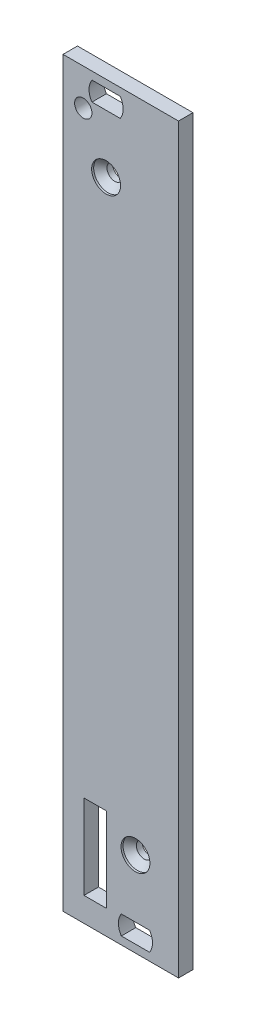
ISO-10303-21;
HEADER;
FILE_DESCRIPTION(('STEP AP214'),'2;1');
FILE_NAME('part.step','',(''),(''),'','','');
FILE_SCHEMA(('AUTOMOTIVE_DESIGN { 1 0 10303 214 1 1 1 1 }'));
ENDSEC;
DATA;
#1=APPLICATION_CONTEXT('core data for automotive mechanical design processes');
#2=APPLICATION_PROTOCOL_DEFINITION('international standard','automotive_design',2000,#1);
#3=PRODUCT_CONTEXT('',#1,'mechanical');
#4=PRODUCT('Part','Part','',(#3));
#5=PRODUCT_RELATED_PRODUCT_CATEGORY('part','',(#4));
#6=PRODUCT_DEFINITION_FORMATION('','',#4);
#7=PRODUCT_DEFINITION_CONTEXT('part definition',#1,'design');
#8=PRODUCT_DEFINITION('design','',#6,#7);
#9=PRODUCT_DEFINITION_SHAPE('','',#8);
#10=(LENGTH_UNIT() NAMED_UNIT(*) SI_UNIT(.MILLI.,.METRE.));
#11=(NAMED_UNIT(*) PLANE_ANGLE_UNIT() SI_UNIT($,.RADIAN.));
#12=(NAMED_UNIT(*) SI_UNIT($,.STERADIAN.) SOLID_ANGLE_UNIT());
#13=UNCERTAINTY_MEASURE_WITH_UNIT(LENGTH_MEASURE(1.E-05),#10,'distance_accuracy_value','');
#14=(GEOMETRIC_REPRESENTATION_CONTEXT(3) GLOBAL_UNCERTAINTY_ASSIGNED_CONTEXT((#13)) GLOBAL_UNIT_ASSIGNED_CONTEXT((#10,
#11,#12)) REPRESENTATION_CONTEXT('',''));
#15=CARTESIAN_POINT('',(0.,0.,0.));
#16=DIRECTION('',(0.,0.,1.));
#17=DIRECTION('',(1.,0.,0.));
#18=AXIS2_PLACEMENT_3D('',#15,#16,#17);
#19=CARTESIAN_POINT('',(5.07999999999998,11.7,2.5));
#20=DIRECTION('',(0.,0.,-1.));
#21=DIRECTION('',(-1.,0.,0.));
#22=AXIS2_PLACEMENT_3D('',#19,#20,#21);
#23=CYLINDRICAL_SURFACE('',#22,2.5);
#24=CARTESIAN_POINT('',(5.07999999999998,11.7,2.5));
#25=DIRECTION('',(0.,0.,-1.));
#26=DIRECTION('',(-1.,0.,0.));
#27=AXIS2_PLACEMENT_3D('',#24,#25,#26);
#28=CIRCLE('',#27,2.5);
#29=CARTESIAN_POINT('',(2.57999999999998,11.7,2.5));
#30=VERTEX_POINT('',#29);
#31=EDGE_CURVE('E21',#30,#30,#28,.F.);
#32=ORIENTED_EDGE('',*,*,#31,.T.);
#33=EDGE_LOOP('',(#32));
#34=FACE_BOUND('',#33,.T.);
#35=CARTESIAN_POINT('',(5.07999999999998,11.7,2.1499999999719));
#36=DIRECTION('',(0.,0.,1.));
#37=DIRECTION('',(1.,0.,0.));
#38=AXIS2_PLACEMENT_3D('',#35,#36,#37);
#39=CIRCLE('',#38,2.50000000007544);
#40=CARTESIAN_POINT('',(7.58000000007542,11.7,2.1499999999719));
#41=VERTEX_POINT('',#40);
#42=EDGE_CURVE('E179',#41,#41,#39,.F.);
#43=ORIENTED_EDGE('',*,*,#42,.T.);
#44=EDGE_LOOP('',(#43));
#45=FACE_BOUND('',#44,.T.);
#46=ADVANCED_FACE('F18',(#34,#45),#23,.F.);
#47=CARTESIAN_POINT('',(0.,110.7,2.5));
#48=DIRECTION('',(0.,0.,-1.));
#49=DIRECTION('',(-1.,0.,0.));
#50=AXIS2_PLACEMENT_3D('',#47,#48,#49);
#51=CYLINDRICAL_SURFACE('',#50,2.5);
#52=CARTESIAN_POINT('',(0.,110.7,2.15000000002874));
#53=DIRECTION('',(0.,0.,1.));
#54=DIRECTION('',(1.,0.,0.));
#55=AXIS2_PLACEMENT_3D('',#52,#53,#54);
#56=CIRCLE('',#55,2.50000000005459);
#57=CARTESIAN_POINT('',(2.50000000005457,110.7,2.15000000002874));
#58=VERTEX_POINT('',#57);
#59=EDGE_CURVE('E139',#58,#58,#56,.F.);
#60=ORIENTED_EDGE('',*,*,#59,.T.);
#61=EDGE_LOOP('',(#60));
#62=FACE_BOUND('',#61,.T.);
#63=CARTESIAN_POINT('',(0.,110.7,2.5));
#64=DIRECTION('',(0.,0.,-1.));
#65=DIRECTION('',(-1.,0.,0.));
#66=AXIS2_PLACEMENT_3D('',#63,#64,#65);
#67=CIRCLE('',#66,2.5);
#68=CARTESIAN_POINT('',(-2.50000000000002,110.7,2.5));
#69=VERTEX_POINT('',#68);
#70=EDGE_CURVE('E178',#69,#69,#67,.F.);
#71=ORIENTED_EDGE('',*,*,#70,.T.);
#72=EDGE_LOOP('',(#71));
#73=FACE_BOUND('',#72,.T.);
#74=ADVANCED_FACE('F417',(#62,#73),#51,.F.);
#75=CARTESIAN_POINT('',(5.07999999999998,11.7,2.15000000002874));
#76=DIRECTION('',(0.,0.,1.));
#77=DIRECTION('',(1.,0.,0.));
#78=AXIS2_PLACEMENT_3D('',#75,#76,#77);
#79=CONICAL_SURFACE('',#78,2.50000000013228,0.785398163397448);
#80=CARTESIAN_POINT('',(5.07999999999998,11.7,1.));
#81=DIRECTION('',(0.,0.,-1.));
#82=DIRECTION('',(-1.,0.,0.));
#83=AXIS2_PLACEMENT_3D('',#80,#81,#82);
#84=CIRCLE('',#83,1.35);
#85=CARTESIAN_POINT('',(3.72999999999998,11.7,1.));
#86=VERTEX_POINT('',#85);
#87=EDGE_CURVE('E172',#86,#86,#84,.T.);
#88=ORIENTED_EDGE('',*,*,#87,.T.);
#89=EDGE_LOOP('',(#88));
#90=FACE_BOUND('',#89,.T.);
#91=ORIENTED_EDGE('',*,*,#42,.F.);
#92=EDGE_LOOP('',(#91));
#93=FACE_BOUND('',#92,.T.);
#94=ADVANCED_FACE('F228',(#90,#93),#79,.F.);
#95=CARTESIAN_POINT('',(12.53,125.4,2.5));
#96=DIRECTION('',(0.,0.,-1.));
#97=DIRECTION('',(-1.,0.,0.));
#98=AXIS2_PLACEMENT_3D('',#95,#96,#97);
#99=PLANE('',#98);
#100=ORIENTED_EDGE('',*,*,#70,.F.);
#101=EDGE_LOOP('',(#100));
#102=FACE_BOUND('',#101,.T.);
#103=CARTESIAN_POINT('',(0.,122.4,2.5));
#104=DIRECTION('',(0.,0.,-1.));
#105=DIRECTION('',(-1.,0.,0.));
#106=AXIS2_PLACEMENT_3D('',#103,#104,#105);
#107=CIRCLE('',#106,2.95);
#108=CARTESIAN_POINT('',(2.44540385212748,124.05,2.5));
#109=VERTEX_POINT('',#108);
#110=CARTESIAN_POINT('',(2.44540385212748,120.75,2.5));
#111=VERTEX_POINT('',#110);
#112=EDGE_CURVE('E166',#109,#111,#107,.T.);
#113=ORIENTED_EDGE('',*,*,#112,.T.);
#114=DIRECTION('',(1.,0.,0.));
#115=VECTOR('',#114,1.);
#116=CARTESIAN_POINT('',(2.44540385212748,120.75,2.5));
#117=LINE('',#116,#115);
#118=CARTESIAN_POINT('',(-2.44540385212752,120.75,2.5));
#119=VERTEX_POINT('',#118);
#120=EDGE_CURVE('E154',#111,#119,#117,.F.);
#121=ORIENTED_EDGE('',*,*,#120,.T.);
#122=CARTESIAN_POINT('',(0.,122.4,2.5));
#123=DIRECTION('',(0.,0.,-1.));
#124=DIRECTION('',(-1.,0.,0.));
#125=AXIS2_PLACEMENT_3D('',#122,#123,#124);
#126=CIRCLE('',#125,2.95);
#127=CARTESIAN_POINT('',(-2.44540385212752,124.05,2.5));
#128=VERTEX_POINT('',#127);
#129=EDGE_CURVE('E206',#119,#128,#126,.T.);
#130=ORIENTED_EDGE('',*,*,#129,.T.);
#131=DIRECTION('',(1.,0.,0.));
#132=VECTOR('',#131,1.);
#133=CARTESIAN_POINT('',(-2.44540385212752,124.05,2.5));
#134=LINE('',#133,#132);
#135=EDGE_CURVE('E158',#128,#109,#134,.T.);
#136=ORIENTED_EDGE('',*,*,#135,.T.);
#137=EDGE_LOOP('',(#113,#121,#130,#136));
#138=FACE_BOUND('',#137,.T.);
#139=CARTESIAN_POINT('',(5.07999999999998,0.,2.5));
#140=DIRECTION('',(0.,0.,-1.));
#141=DIRECTION('',(-1.,0.,0.));
#142=AXIS2_PLACEMENT_3D('',#139,#140,#141);
#143=CIRCLE('',#142,2.95);
#144=CARTESIAN_POINT('',(7.52540385212747,1.64999999999997,2.5));
#145=VERTEX_POINT('',#144);
#146=CARTESIAN_POINT('',(7.52540385212748,-1.65000000000003,2.5));
#147=VERTEX_POINT('',#146);
#148=EDGE_CURVE('E84',#145,#147,#143,.T.);
#149=ORIENTED_EDGE('',*,*,#148,.T.);
#150=DIRECTION('',(1.,0.,0.));
#151=VECTOR('',#150,1.);
#152=CARTESIAN_POINT('',(7.52540385212748,-1.65000000000003,2.5));
#153=LINE('',#152,#151);
#154=CARTESIAN_POINT('',(2.63459614787248,-1.65000000000003,2.5));
#155=VERTEX_POINT('',#154);
#156=EDGE_CURVE('E163',#147,#155,#153,.F.);
#157=ORIENTED_EDGE('',*,*,#156,.T.);
#158=CARTESIAN_POINT('',(5.07999999999998,0.,2.5));
#159=DIRECTION('',(0.,0.,-1.));
#160=DIRECTION('',(-1.,0.,0.));
#161=AXIS2_PLACEMENT_3D('',#158,#159,#160);
#162=CIRCLE('',#161,2.95);
#163=CARTESIAN_POINT('',(2.63459614787248,1.64999999999997,2.5));
#164=VERTEX_POINT('',#163);
#165=EDGE_CURVE('E210',#155,#164,#162,.T.);
#166=ORIENTED_EDGE('',*,*,#165,.T.);
#167=DIRECTION('',(1.,0.,0.));
#168=VECTOR('',#167,1.);
#169=CARTESIAN_POINT('',(2.63459614787248,1.64999999999997,2.5));
#170=LINE('',#169,#168);
#171=EDGE_CURVE('E168',#164,#145,#170,.T.);
#172=ORIENTED_EDGE('',*,*,#171,.T.);
#173=EDGE_LOOP('',(#149,#157,#166,#172));
#174=FACE_BOUND('',#173,.T.);
#175=ORIENTED_EDGE('',*,*,#31,.F.);
#176=EDGE_LOOP('',(#175));
#177=FACE_BOUND('',#176,.T.);
#178=DIRECTION('',(0.,1.,0.));
#179=VECTOR('',#178,1.);
#180=CARTESIAN_POINT('',(0.079999999999977,1.19999999999995,2.5));
#181=LINE('',#180,#179);
#182=CARTESIAN_POINT('',(0.0799999999999774,15.8,2.5));
#183=VERTEX_POINT('',#182);
#184=CARTESIAN_POINT('',(0.0799999999999771,1.19999999999995,2.5));
#185=VERTEX_POINT('',#184);
#186=EDGE_CURVE('E93',#183,#185,#181,.F.);
#187=ORIENTED_EDGE('',*,*,#186,.T.);
#188=DIRECTION('',(1.,0.,0.));
#189=VECTOR('',#188,1.);
#190=CARTESIAN_POINT('',(0.079999999999977,1.19999999999995,2.5));
#191=LINE('',#190,#189);
#192=CARTESIAN_POINT('',(-3.82000000000002,1.19999999999995,2.5));
#193=VERTEX_POINT('',#192);
#194=EDGE_CURVE('E175',#185,#193,#191,.F.);
#195=ORIENTED_EDGE('',*,*,#194,.T.);
#196=DIRECTION('',(0.,1.,0.));
#197=VECTOR('',#196,1.);
#198=CARTESIAN_POINT('',(-3.82000000000002,1.19999999999995,2.5));
#199=LINE('',#198,#197);
#200=CARTESIAN_POINT('',(-3.82000000000002,15.8,2.5));
#201=VERTEX_POINT('',#200);
#202=EDGE_CURVE('E324',#193,#201,#199,.T.);
#203=ORIENTED_EDGE('',*,*,#202,.T.);
#204=DIRECTION('',(1.,0.,0.));
#205=VECTOR('',#204,1.);
#206=CARTESIAN_POINT('',(0.079999999999977,15.8,2.5));
#207=LINE('',#206,#205);
#208=EDGE_CURVE('E321',#201,#183,#207,.T.);
#209=ORIENTED_EDGE('',*,*,#208,.T.);
#210=EDGE_LOOP('',(#187,#195,#203,#209));
#211=FACE_BOUND('',#210,.T.);
#212=CARTESIAN_POINT('',(-3.95000000000002,119.1,2.5));
#213=DIRECTION('',(0.,0.,-1.));
#214=DIRECTION('',(-1.,0.,0.));
#215=AXIS2_PLACEMENT_3D('',#212,#213,#214);
#216=CIRCLE('',#215,1.5);
#217=CARTESIAN_POINT('',(-5.45000000000002,119.1,2.5));
#218=VERTEX_POINT('',#217);
#219=EDGE_CURVE('E215',#218,#218,#216,.T.);
#220=ORIENTED_EDGE('',*,*,#219,.T.);
#221=EDGE_LOOP('',(#220));
#222=FACE_BOUND('',#221,.T.);
#223=DIRECTION('',(1.,0.,0.));
#224=VECTOR('',#223,1.);
#225=CARTESIAN_POINT('',(-7.45000000000002,125.4,2.5));
#226=LINE('',#225,#224);
#227=CARTESIAN_POINT('',(12.53,125.4,2.5));
#228=VERTEX_POINT('',#227);
#229=CARTESIAN_POINT('',(-7.45000000000002,125.4,2.5));
#230=VERTEX_POINT('',#229);
#231=EDGE_CURVE('E369',#228,#230,#226,.F.);
#232=ORIENTED_EDGE('',*,*,#231,.T.);
#233=DIRECTION('',(0.,1.,0.));
#234=VECTOR('',#233,1.);
#235=CARTESIAN_POINT('',(-7.45000000000002,-3.00000000000004,2.5));
#236=LINE('',#235,#234);
#237=CARTESIAN_POINT('',(-7.45000000000002,-3.00000000000003,2.5));
#238=VERTEX_POINT('',#237);
#239=EDGE_CURVE('E124',#230,#238,#236,.F.);
#240=ORIENTED_EDGE('',*,*,#239,.T.);
#241=DIRECTION('',(1.,0.,0.));
#242=VECTOR('',#241,1.);
#243=CARTESIAN_POINT('',(-7.45000000000002,-3.00000000000004,2.5));
#244=LINE('',#243,#242);
#245=CARTESIAN_POINT('',(12.53,-3.00000000000003,2.5));
#246=VERTEX_POINT('',#245);
#247=EDGE_CURVE('E118',#238,#246,#244,.T.);
#248=ORIENTED_EDGE('',*,*,#247,.T.);
#249=DIRECTION('',(0.,1.,0.));
#250=VECTOR('',#249,1.);
#251=CARTESIAN_POINT('',(12.53,-3.00000000000004,2.5));
#252=LINE('',#251,#250);
#253=EDGE_CURVE('E121',#246,#228,#252,.T.);
#254=ORIENTED_EDGE('',*,*,#253,.T.);
#255=EDGE_LOOP('',(#232,#240,#248,#254));
#256=FACE_BOUND('',#255,.T.);
#257=ADVANCED_FACE('F120',(#102,#138,#174,#177,#211,#222,#256),#99,.F.);
#258=CARTESIAN_POINT('',(0.,110.7,2.14999999991505));
#259=DIRECTION('',(0.,0.,1.));
#260=DIRECTION('',(1.,0.,0.));
#261=AXIS2_PLACEMENT_3D('',#258,#259,#260);
#262=CONICAL_SURFACE('',#261,2.4999999999409,0.785398163422163);
#263=CARTESIAN_POINT('',(0.,110.7,1.));
#264=DIRECTION('',(0.,0.,-1.));
#265=DIRECTION('',(-1.,0.,0.));
#266=AXIS2_PLACEMENT_3D('',#263,#264,#265);
#267=CIRCLE('',#266,1.35);
#268=CARTESIAN_POINT('',(-1.35000000000001,110.7,1.));
#269=VERTEX_POINT('',#268);
#270=EDGE_CURVE('E150',#269,#269,#267,.T.);
#271=ORIENTED_EDGE('',*,*,#270,.T.);
#272=EDGE_LOOP('',(#271));
#273=FACE_BOUND('',#272,.T.);
#274=ORIENTED_EDGE('',*,*,#59,.F.);
#275=EDGE_LOOP('',(#274));
#276=FACE_BOUND('',#275,.T.);
#277=ADVANCED_FACE('F227',(#273,#276),#262,.F.);
#278=CARTESIAN_POINT('',(12.53,-3.00000000000004,2.5));
#279=DIRECTION('',(-1.,0.,0.));
#280=DIRECTION('',(0.,0.,1.));
#281=AXIS2_PLACEMENT_3D('',#278,#279,#280);
#282=PLANE('',#281);
#283=DIRECTION('',(0.,0.,-1.));
#284=VECTOR('',#283,1.);
#285=CARTESIAN_POINT('',(12.53,125.4,2.5));
#286=LINE('',#285,#284);
#287=CARTESIAN_POINT('',(12.53,125.4,0.));
#288=VERTEX_POINT('',#287);
#289=EDGE_CURVE('E137',#288,#228,#286,.F.);
#290=ORIENTED_EDGE('',*,*,#289,.T.);
#291=ORIENTED_EDGE('',*,*,#253,.F.);
#292=DIRECTION('',(0.,0.,1.));
#293=VECTOR('',#292,1.);
#294=CARTESIAN_POINT('',(12.53,-3.00000000000004,2.5));
#295=LINE('',#294,#293);
#296=CARTESIAN_POINT('',(12.53,-3.00000000000003,0.));
#297=VERTEX_POINT('',#296);
#298=EDGE_CURVE('E129',#246,#297,#295,.F.);
#299=ORIENTED_EDGE('',*,*,#298,.T.);
#300=DIRECTION('',(0.,1.,0.));
#301=VECTOR('',#300,1.);
#302=CARTESIAN_POINT('',(12.53,125.4,0.));
#303=LINE('',#302,#301);
#304=EDGE_CURVE('E153',#288,#297,#303,.F.);
#305=ORIENTED_EDGE('',*,*,#304,.F.);
#306=EDGE_LOOP('',(#290,#291,#299,#305));
#307=FACE_BOUND('',#306,.T.);
#308=ADVANCED_FACE('F133',(#307),#282,.F.);
#309=CARTESIAN_POINT('',(-7.45000000000002,-3.00000000000004,2.5));
#310=DIRECTION('',(0.,1.,0.));
#311=DIRECTION('',(0.,0.,1.));
#312=AXIS2_PLACEMENT_3D('',#309,#310,#311);
#313=PLANE('',#312);
#314=ORIENTED_EDGE('',*,*,#298,.F.);
#315=ORIENTED_EDGE('',*,*,#247,.F.);
#316=DIRECTION('',(0.,0.,-1.));
#317=VECTOR('',#316,1.);
#318=CARTESIAN_POINT('',(-7.45000000000002,-3.00000000000004,2.5));
#319=LINE('',#318,#317);
#320=CARTESIAN_POINT('',(-7.45000000000002,-3.00000000000003,0.));
#321=VERTEX_POINT('',#320);
#322=EDGE_CURVE('E146',#238,#321,#319,.T.);
#323=ORIENTED_EDGE('',*,*,#322,.T.);
#324=DIRECTION('',(-1.,0.,0.));
#325=VECTOR('',#324,1.);
#326=CARTESIAN_POINT('',(12.53,-3.00000000000003,0.));
#327=LINE('',#326,#325);
#328=EDGE_CURVE('E143',#297,#321,#327,.T.);
#329=ORIENTED_EDGE('',*,*,#328,.F.);
#330=EDGE_LOOP('',(#314,#315,#323,#329));
#331=FACE_BOUND('',#330,.T.);
#332=ADVANCED_FACE('F141',(#331),#313,.F.);
#333=CARTESIAN_POINT('',(-7.45000000000002,-3.00000000000004,2.5));
#334=DIRECTION('',(1.,0.,0.));
#335=DIRECTION('',(0.,0.,-1.));
#336=AXIS2_PLACEMENT_3D('',#333,#334,#335);
#337=PLANE('',#336);
#338=ORIENTED_EDGE('',*,*,#322,.F.);
#339=ORIENTED_EDGE('',*,*,#239,.F.);
#340=DIRECTION('',(0.,0.,-1.));
#341=VECTOR('',#340,1.);
#342=CARTESIAN_POINT('',(-7.45000000000002,125.4,2.5));
#343=LINE('',#342,#341);
#344=CARTESIAN_POINT('',(-7.45000000000002,125.4,0.));
#345=VERTEX_POINT('',#344);
#346=EDGE_CURVE('E217',#230,#345,#343,.T.);
#347=ORIENTED_EDGE('',*,*,#346,.T.);
#348=DIRECTION('',(0.,1.,0.));
#349=VECTOR('',#348,1.);
#350=CARTESIAN_POINT('',(-7.45000000000002,125.4,0.));
#351=LINE('',#350,#349);
#352=EDGE_CURVE('E343',#321,#345,#351,.T.);
#353=ORIENTED_EDGE('',*,*,#352,.F.);
#354=EDGE_LOOP('',(#338,#339,#347,#353));
#355=FACE_BOUND('',#354,.T.);
#356=ADVANCED_FACE('F248',(#355),#337,.F.);
#357=CARTESIAN_POINT('',(-7.45000000000002,125.4,2.5));
#358=DIRECTION('',(0.,-1.,0.));
#359=DIRECTION('',(0.,0.,-1.));
#360=AXIS2_PLACEMENT_3D('',#357,#358,#359);
#361=PLANE('',#360);
#362=ORIENTED_EDGE('',*,*,#346,.F.);
#363=ORIENTED_EDGE('',*,*,#231,.F.);
#364=ORIENTED_EDGE('',*,*,#289,.F.);
#365=DIRECTION('',(-1.,0.,0.));
#366=VECTOR('',#365,1.);
#367=CARTESIAN_POINT('',(12.53,125.4,0.));
#368=LINE('',#367,#366);
#369=EDGE_CURVE('E205',#345,#288,#368,.F.);
#370=ORIENTED_EDGE('',*,*,#369,.F.);
#371=EDGE_LOOP('',(#362,#363,#364,#370));
#372=FACE_BOUND('',#371,.T.);
#373=ADVANCED_FACE('F237',(#372),#361,.F.);
#374=CARTESIAN_POINT('',(-3.95000000000002,119.1,0.));
#375=DIRECTION('',(0.,0.,-1.));
#376=DIRECTION('',(-1.,0.,0.));
#377=AXIS2_PLACEMENT_3D('',#374,#375,#376);
#378=CYLINDRICAL_SURFACE('',#377,1.5);
#379=CARTESIAN_POINT('',(-3.95000000000002,119.1,0.));
#380=DIRECTION('',(0.,0.,-1.));
#381=DIRECTION('',(-1.,0.,0.));
#382=AXIS2_PLACEMENT_3D('',#379,#380,#381);
#383=CIRCLE('',#382,1.5);
#384=CARTESIAN_POINT('',(-5.45000000000002,119.1,0.));
#385=VERTEX_POINT('',#384);
#386=EDGE_CURVE('E201',#385,#385,#383,.F.);
#387=ORIENTED_EDGE('',*,*,#386,.F.);
#388=EDGE_LOOP('',(#387));
#389=FACE_BOUND('',#388,.T.);
#390=ORIENTED_EDGE('',*,*,#219,.F.);
#391=EDGE_LOOP('',(#390));
#392=FACE_BOUND('',#391,.T.);
#393=ADVANCED_FACE('F234',(#389,#392),#378,.F.);
#394=CARTESIAN_POINT('',(0.079999999999977,1.19999999999995,0.));
#395=DIRECTION('',(1.,0.,0.));
#396=DIRECTION('',(0.,0.,-1.));
#397=AXIS2_PLACEMENT_3D('',#394,#395,#396);
#398=PLANE('',#397);
#399=DIRECTION('',(0.,0.,1.));
#400=VECTOR('',#399,1.);
#401=CARTESIAN_POINT('',(0.0799999999999779,15.8,0.));
#402=LINE('',#401,#400);
#403=CARTESIAN_POINT('',(0.0799999999999774,15.8,0.));
#404=VERTEX_POINT('',#403);
#405=EDGE_CURVE('E363',#183,#404,#402,.F.);
#406=ORIENTED_EDGE('',*,*,#405,.T.);
#407=DIRECTION('',(0.,1.,0.));
#408=VECTOR('',#407,1.);
#409=CARTESIAN_POINT('',(0.0799999999999777,125.4,0.));
#410=LINE('',#409,#408);
#411=CARTESIAN_POINT('',(0.0799999999999771,1.19999999999995,0.));
#412=VERTEX_POINT('',#411);
#413=EDGE_CURVE('E204',#412,#404,#410,.T.);
#414=ORIENTED_EDGE('',*,*,#413,.F.);
#415=DIRECTION('',(0.,0.,-1.));
#416=VECTOR('',#415,1.);
#417=CARTESIAN_POINT('',(0.079999999999977,1.19999999999995,0.));
#418=LINE('',#417,#416);
#419=EDGE_CURVE('E358',#412,#185,#418,.F.);
#420=ORIENTED_EDGE('',*,*,#419,.T.);
#421=ORIENTED_EDGE('',*,*,#186,.F.);
#422=EDGE_LOOP('',(#406,#414,#420,#421));
#423=FACE_BOUND('',#422,.T.);
#424=ADVANCED_FACE('F236',(#423),#398,.F.);
#425=CARTESIAN_POINT('',(0.079999999999977,15.8,0.));
#426=DIRECTION('',(0.,1.,0.));
#427=DIRECTION('',(0.,0.,1.));
#428=AXIS2_PLACEMENT_3D('',#425,#426,#427);
#429=PLANE('',#428);
#430=DIRECTION('',(0.,0.,1.));
#431=VECTOR('',#430,1.);
#432=CARTESIAN_POINT('',(-3.82000000000002,15.8,0.));
#433=LINE('',#432,#431);
#434=CARTESIAN_POINT('',(-3.82000000000002,15.8,0.));
#435=VERTEX_POINT('',#434);
#436=EDGE_CURVE('E314',#201,#435,#433,.F.);
#437=ORIENTED_EDGE('',*,*,#436,.T.);
#438=DIRECTION('',(-1.,0.,0.));
#439=VECTOR('',#438,1.);
#440=CARTESIAN_POINT('',(12.53,15.8,0.));
#441=LINE('',#440,#439);
#442=EDGE_CURVE('E319',#404,#435,#441,.T.);
#443=ORIENTED_EDGE('',*,*,#442,.F.);
#444=ORIENTED_EDGE('',*,*,#405,.F.);
#445=ORIENTED_EDGE('',*,*,#208,.F.);
#446=EDGE_LOOP('',(#437,#443,#444,#445));
#447=FACE_BOUND('',#446,.T.);
#448=ADVANCED_FACE('F245',(#447),#429,.F.);
#449=CARTESIAN_POINT('',(-3.82000000000002,1.19999999999995,0.));
#450=DIRECTION('',(-1.,0.,0.));
#451=DIRECTION('',(0.,0.,1.));
#452=AXIS2_PLACEMENT_3D('',#449,#450,#451);
#453=PLANE('',#452);
#454=DIRECTION('',(0.,0.,-1.));
#455=VECTOR('',#454,1.);
#456=CARTESIAN_POINT('',(-3.82000000000002,1.19999999999995,0.));
#457=LINE('',#456,#455);
#458=CARTESIAN_POINT('',(-3.82000000000002,1.19999999999995,0.));
#459=VERTEX_POINT('',#458);
#460=EDGE_CURVE('E330',#193,#459,#457,.T.);
#461=ORIENTED_EDGE('',*,*,#460,.T.);
#462=DIRECTION('',(0.,1.,0.));
#463=VECTOR('',#462,1.);
#464=CARTESIAN_POINT('',(-3.82000000000002,125.4,0.));
#465=LINE('',#464,#463);
#466=EDGE_CURVE('E328',#435,#459,#465,.F.);
#467=ORIENTED_EDGE('',*,*,#466,.F.);
#468=ORIENTED_EDGE('',*,*,#436,.F.);
#469=ORIENTED_EDGE('',*,*,#202,.F.);
#470=EDGE_LOOP('',(#461,#467,#468,#469));
#471=FACE_BOUND('',#470,.T.);
#472=ADVANCED_FACE('F301',(#471),#453,.F.);
#473=CARTESIAN_POINT('',(0.079999999999977,1.19999999999995,0.));
#474=DIRECTION('',(0.,-1.,0.));
#475=DIRECTION('',(0.,0.,-1.));
#476=AXIS2_PLACEMENT_3D('',#473,#474,#475);
#477=PLANE('',#476);
#478=ORIENTED_EDGE('',*,*,#419,.F.);
#479=DIRECTION('',(-1.,0.,0.));
#480=VECTOR('',#479,1.);
#481=CARTESIAN_POINT('',(12.53,1.19999999999995,0.));
#482=LINE('',#481,#480);
#483=EDGE_CURVE('E200',#459,#412,#482,.F.);
#484=ORIENTED_EDGE('',*,*,#483,.F.);
#485=ORIENTED_EDGE('',*,*,#460,.F.);
#486=ORIENTED_EDGE('',*,*,#194,.F.);
#487=EDGE_LOOP('',(#478,#484,#485,#486));
#488=FACE_BOUND('',#487,.T.);
#489=ADVANCED_FACE('F297',(#488),#477,.F.);
#490=CARTESIAN_POINT('',(5.07999999999998,11.7,2.5));
#491=DIRECTION('',(0.,0.,-1.));
#492=DIRECTION('',(-1.,0.,0.));
#493=AXIS2_PLACEMENT_3D('',#490,#491,#492);
#494=CYLINDRICAL_SURFACE('',#493,1.35);
#495=CARTESIAN_POINT('',(5.07999999999998,11.7,0.));
#496=DIRECTION('',(0.,0.,-1.));
#497=DIRECTION('',(-1.,0.,0.));
#498=AXIS2_PLACEMENT_3D('',#495,#496,#497);
#499=CIRCLE('',#498,1.35);
#500=CARTESIAN_POINT('',(3.72999999999998,11.7,0.));
#501=VERTEX_POINT('',#500);
#502=EDGE_CURVE('E197',#501,#501,#499,.F.);
#503=ORIENTED_EDGE('',*,*,#502,.F.);
#504=EDGE_LOOP('',(#503));
#505=FACE_BOUND('',#504,.T.);
#506=ORIENTED_EDGE('',*,*,#87,.F.);
#507=EDGE_LOOP('',(#506));
#508=FACE_BOUND('',#507,.T.);
#509=ADVANCED_FACE('F294',(#505,#508),#494,.F.);
#510=CARTESIAN_POINT('',(5.07999999999998,0.,0.));
#511=DIRECTION('',(0.,0.,-1.));
#512=DIRECTION('',(-1.,0.,0.));
#513=AXIS2_PLACEMENT_3D('',#510,#511,#512);
#514=CYLINDRICAL_SURFACE('',#513,2.95);
#515=DIRECTION('',(0.,0.,-1.));
#516=VECTOR('',#515,1.);
#517=CARTESIAN_POINT('',(7.52540385212748,-1.65000000000003,0.));
#518=LINE('',#517,#516);
#519=CARTESIAN_POINT('',(7.52540385212747,-1.65000000000004,0.));
#520=VERTEX_POINT('',#519);
#521=EDGE_CURVE('E167',#520,#147,#518,.F.);
#522=ORIENTED_EDGE('',*,*,#521,.T.);
#523=ORIENTED_EDGE('',*,*,#148,.F.);
#524=DIRECTION('',(0.,0.,1.));
#525=VECTOR('',#524,1.);
#526=CARTESIAN_POINT('',(7.52540385212748,1.64999999999997,0.));
#527=LINE('',#526,#525);
#528=CARTESIAN_POINT('',(7.52540385212747,1.64999999999997,0.));
#529=VERTEX_POINT('',#528);
#530=EDGE_CURVE('E171',#145,#529,#527,.F.);
#531=ORIENTED_EDGE('',*,*,#530,.T.);
#532=CARTESIAN_POINT('',(5.07999999999998,0.,0.));
#533=DIRECTION('',(0.,0.,-1.));
#534=DIRECTION('',(-1.,0.,0.));
#535=AXIS2_PLACEMENT_3D('',#532,#533,#534);
#536=CIRCLE('',#535,2.95);
#537=EDGE_CURVE('E194',#520,#529,#536,.F.);
#538=ORIENTED_EDGE('',*,*,#537,.F.);
#539=EDGE_LOOP('',(#522,#523,#531,#538));
#540=FACE_BOUND('',#539,.T.);
#541=ADVANCED_FACE('F290',(#540),#514,.F.);
#542=CARTESIAN_POINT('',(2.63459614787248,1.64999999999997,0.));
#543=DIRECTION('',(0.,1.,0.));
#544=DIRECTION('',(0.,0.,1.));
#545=AXIS2_PLACEMENT_3D('',#542,#543,#544);
#546=PLANE('',#545);
#547=DIRECTION('',(0.,0.,-1.));
#548=VECTOR('',#547,1.);
#549=CARTESIAN_POINT('',(2.63459614787248,1.64999999999997,0.));
#550=LINE('',#549,#548);
#551=CARTESIAN_POINT('',(2.63459614787248,1.64999999999997,0.));
#552=VERTEX_POINT('',#551);
#553=EDGE_CURVE('E170',#164,#552,#550,.T.);
#554=ORIENTED_EDGE('',*,*,#553,.T.);
#555=DIRECTION('',(-1.,0.,0.));
#556=VECTOR('',#555,1.);
#557=CARTESIAN_POINT('',(12.53,1.64999999999997,0.));
#558=LINE('',#557,#556);
#559=EDGE_CURVE('E193',#529,#552,#558,.T.);
#560=ORIENTED_EDGE('',*,*,#559,.F.);
#561=ORIENTED_EDGE('',*,*,#530,.F.);
#562=ORIENTED_EDGE('',*,*,#171,.F.);
#563=EDGE_LOOP('',(#554,#560,#561,#562));
#564=FACE_BOUND('',#563,.T.);
#565=ADVANCED_FACE('F286',(#564),#546,.F.);
#566=CARTESIAN_POINT('',(5.07999999999998,0.,0.));
#567=DIRECTION('',(0.,0.,-1.));
#568=DIRECTION('',(-1.,0.,0.));
#569=AXIS2_PLACEMENT_3D('',#566,#567,#568);
#570=CYLINDRICAL_SURFACE('',#569,2.95);
#571=DIRECTION('',(0.,0.,-1.));
#572=VECTOR('',#571,1.);
#573=CARTESIAN_POINT('',(2.63459614787248,-1.65000000000003,0.));
#574=LINE('',#573,#572);
#575=CARTESIAN_POINT('',(2.63459614787248,-1.65000000000004,0.));
#576=VERTEX_POINT('',#575);
#577=EDGE_CURVE('E213',#155,#576,#574,.T.);
#578=ORIENTED_EDGE('',*,*,#577,.T.);
#579=CARTESIAN_POINT('',(5.07999999999998,0.,0.));
#580=DIRECTION('',(0.,0.,-1.));
#581=DIRECTION('',(-1.,0.,0.));
#582=AXIS2_PLACEMENT_3D('',#579,#580,#581);
#583=CIRCLE('',#582,2.95);
#584=EDGE_CURVE('E190',#552,#576,#583,.F.);
#585=ORIENTED_EDGE('',*,*,#584,.F.);
#586=ORIENTED_EDGE('',*,*,#553,.F.);
#587=ORIENTED_EDGE('',*,*,#165,.F.);
#588=EDGE_LOOP('',(#578,#585,#586,#587));
#589=FACE_BOUND('',#588,.T.);
#590=ADVANCED_FACE('F282',(#589),#570,.F.);
#591=CARTESIAN_POINT('',(7.52540385212748,-1.65000000000003,0.));
#592=DIRECTION('',(0.,-1.,0.));
#593=DIRECTION('',(0.,0.,-1.));
#594=AXIS2_PLACEMENT_3D('',#591,#592,#593);
#595=PLANE('',#594);
#596=ORIENTED_EDGE('',*,*,#521,.F.);
#597=DIRECTION('',(-1.,0.,0.));
#598=VECTOR('',#597,1.);
#599=CARTESIAN_POINT('',(12.53,-1.65000000000004,0.));
#600=LINE('',#599,#598);
#601=EDGE_CURVE('E189',#576,#520,#600,.F.);
#602=ORIENTED_EDGE('',*,*,#601,.F.);
#603=ORIENTED_EDGE('',*,*,#577,.F.);
#604=ORIENTED_EDGE('',*,*,#156,.F.);
#605=EDGE_LOOP('',(#596,#602,#603,#604));
#606=FACE_BOUND('',#605,.T.);
#607=ADVANCED_FACE('F278',(#606),#595,.F.);
#608=CARTESIAN_POINT('',(0.,122.4,0.));
#609=DIRECTION('',(0.,0.,-1.));
#610=DIRECTION('',(-1.,0.,0.));
#611=AXIS2_PLACEMENT_3D('',#608,#609,#610);
#612=CYLINDRICAL_SURFACE('',#611,2.95);
#613=DIRECTION('',(0.,0.,-1.));
#614=VECTOR('',#613,1.);
#615=CARTESIAN_POINT('',(2.44540385212748,120.75,0.));
#616=LINE('',#615,#614);
#617=CARTESIAN_POINT('',(2.44540385212748,120.75,0.));
#618=VERTEX_POINT('',#617);
#619=EDGE_CURVE('E157',#618,#111,#616,.F.);
#620=ORIENTED_EDGE('',*,*,#619,.T.);
#621=ORIENTED_EDGE('',*,*,#112,.F.);
#622=DIRECTION('',(0.,0.,1.));
#623=VECTOR('',#622,1.);
#624=CARTESIAN_POINT('',(2.44540385212748,124.05,0.));
#625=LINE('',#624,#623);
#626=CARTESIAN_POINT('',(2.44540385212748,124.05,0.));
#627=VERTEX_POINT('',#626);
#628=EDGE_CURVE('E162',#109,#627,#625,.F.);
#629=ORIENTED_EDGE('',*,*,#628,.T.);
#630=CARTESIAN_POINT('',(0.,122.4,0.));
#631=DIRECTION('',(0.,0.,-1.));
#632=DIRECTION('',(-1.,0.,0.));
#633=AXIS2_PLACEMENT_3D('',#630,#631,#632);
#634=CIRCLE('',#633,2.95);
#635=EDGE_CURVE('E186',#618,#627,#634,.F.);
#636=ORIENTED_EDGE('',*,*,#635,.F.);
#637=EDGE_LOOP('',(#620,#621,#629,#636));
#638=FACE_BOUND('',#637,.T.);
#639=ADVANCED_FACE('F274',(#638),#612,.F.);
#640=CARTESIAN_POINT('',(-2.44540385212752,124.05,0.));
#641=DIRECTION('',(0.,1.,0.));
#642=DIRECTION('',(0.,0.,1.));
#643=AXIS2_PLACEMENT_3D('',#640,#641,#642);
#644=PLANE('',#643);
#645=DIRECTION('',(0.,0.,-1.));
#646=VECTOR('',#645,1.);
#647=CARTESIAN_POINT('',(-2.44540385212752,124.05,0.));
#648=LINE('',#647,#646);
#649=CARTESIAN_POINT('',(-2.44540385212752,124.05,0.));
#650=VERTEX_POINT('',#649);
#651=EDGE_CURVE('E161',#128,#650,#648,.T.);
#652=ORIENTED_EDGE('',*,*,#651,.T.);
#653=DIRECTION('',(-1.,0.,0.));
#654=VECTOR('',#653,1.);
#655=CARTESIAN_POINT('',(12.53,124.05,0.));
#656=LINE('',#655,#654);
#657=EDGE_CURVE('E185',#627,#650,#656,.T.);
#658=ORIENTED_EDGE('',*,*,#657,.F.);
#659=ORIENTED_EDGE('',*,*,#628,.F.);
#660=ORIENTED_EDGE('',*,*,#135,.F.);
#661=EDGE_LOOP('',(#652,#658,#659,#660));
#662=FACE_BOUND('',#661,.T.);
#663=ADVANCED_FACE('F271',(#662),#644,.F.);
#664=CARTESIAN_POINT('',(0.,122.4,0.));
#665=DIRECTION('',(0.,0.,-1.));
#666=DIRECTION('',(-1.,0.,0.));
#667=AXIS2_PLACEMENT_3D('',#664,#665,#666);
#668=CYLINDRICAL_SURFACE('',#667,2.95);
#669=DIRECTION('',(0.,0.,-1.));
#670=VECTOR('',#669,1.);
#671=CARTESIAN_POINT('',(-2.44540385212752,120.75,0.));
#672=LINE('',#671,#670);
#673=CARTESIAN_POINT('',(-2.44540385212752,120.75,0.));
#674=VERTEX_POINT('',#673);
#675=EDGE_CURVE('E36',#119,#674,#672,.T.);
#676=ORIENTED_EDGE('',*,*,#675,.T.);
#677=CARTESIAN_POINT('',(0.,122.4,0.));
#678=DIRECTION('',(0.,0.,-1.));
#679=DIRECTION('',(-1.,0.,0.));
#680=AXIS2_PLACEMENT_3D('',#677,#678,#679);
#681=CIRCLE('',#680,2.95);
#682=EDGE_CURVE('E182',#650,#674,#681,.F.);
#683=ORIENTED_EDGE('',*,*,#682,.F.);
#684=ORIENTED_EDGE('',*,*,#651,.F.);
#685=ORIENTED_EDGE('',*,*,#129,.F.);
#686=EDGE_LOOP('',(#676,#683,#684,#685));
#687=FACE_BOUND('',#686,.T.);
#688=ADVANCED_FACE('F267',(#687),#668,.F.);
#689=CARTESIAN_POINT('',(2.44540385212748,120.75,0.));
#690=DIRECTION('',(0.,-1.,0.));
#691=DIRECTION('',(0.,0.,-1.));
#692=AXIS2_PLACEMENT_3D('',#689,#690,#691);
#693=PLANE('',#692);
#694=ORIENTED_EDGE('',*,*,#619,.F.);
#695=DIRECTION('',(-1.,0.,0.));
#696=VECTOR('',#695,1.);
#697=CARTESIAN_POINT('',(12.53,120.75,0.));
#698=LINE('',#697,#696);
#699=EDGE_CURVE('E27',#674,#618,#698,.F.);
#700=ORIENTED_EDGE('',*,*,#699,.F.);
#701=ORIENTED_EDGE('',*,*,#675,.F.);
#702=ORIENTED_EDGE('',*,*,#120,.F.);
#703=EDGE_LOOP('',(#694,#700,#701,#702));
#704=FACE_BOUND('',#703,.T.);
#705=ADVANCED_FACE('F260',(#704),#693,.F.);
#706=CARTESIAN_POINT('',(0.,110.7,2.5));
#707=DIRECTION('',(0.,0.,-1.));
#708=DIRECTION('',(-1.,0.,0.));
#709=AXIS2_PLACEMENT_3D('',#706,#707,#708);
#710=CYLINDRICAL_SURFACE('',#709,1.35);
#711=CARTESIAN_POINT('',(0.,110.7,0.));
#712=DIRECTION('',(0.,0.,-1.));
#713=DIRECTION('',(-1.,0.,0.));
#714=AXIS2_PLACEMENT_3D('',#711,#712,#713);
#715=CIRCLE('',#714,1.35);
#716=CARTESIAN_POINT('',(-1.35000000000001,110.7,0.));
#717=VERTEX_POINT('',#716);
#718=EDGE_CURVE('E11',#717,#717,#715,.F.);
#719=ORIENTED_EDGE('',*,*,#718,.F.);
#720=EDGE_LOOP('',(#719));
#721=FACE_BOUND('',#720,.T.);
#722=ORIENTED_EDGE('',*,*,#270,.F.);
#723=EDGE_LOOP('',(#722));
#724=FACE_BOUND('',#723,.T.);
#725=ADVANCED_FACE('F254',(#721,#724),#710,.F.);
#726=CARTESIAN_POINT('',(12.53,125.4,0.));
#727=DIRECTION('',(0.,0.,-1.));
#728=DIRECTION('',(-1.,0.,0.));
#729=AXIS2_PLACEMENT_3D('',#726,#727,#728);
#730=PLANE('',#729);
#731=ORIENTED_EDGE('',*,*,#718,.T.);
#732=EDGE_LOOP('',(#731));
#733=FACE_BOUND('',#732,.T.);
#734=ORIENTED_EDGE('',*,*,#682,.T.);
#735=ORIENTED_EDGE('',*,*,#699,.T.);
#736=ORIENTED_EDGE('',*,*,#635,.T.);
#737=ORIENTED_EDGE('',*,*,#657,.T.);
#738=EDGE_LOOP('',(#734,#735,#736,#737));
#739=FACE_BOUND('',#738,.T.);
#740=ORIENTED_EDGE('',*,*,#584,.T.);
#741=ORIENTED_EDGE('',*,*,#601,.T.);
#742=ORIENTED_EDGE('',*,*,#537,.T.);
#743=ORIENTED_EDGE('',*,*,#559,.T.);
#744=EDGE_LOOP('',(#740,#741,#742,#743));
#745=FACE_BOUND('',#744,.T.);
#746=ORIENTED_EDGE('',*,*,#502,.T.);
#747=EDGE_LOOP('',(#746));
#748=FACE_BOUND('',#747,.T.);
#749=ORIENTED_EDGE('',*,*,#466,.T.);
#750=ORIENTED_EDGE('',*,*,#483,.T.);
#751=ORIENTED_EDGE('',*,*,#413,.T.);
#752=ORIENTED_EDGE('',*,*,#442,.T.);
#753=EDGE_LOOP('',(#749,#750,#751,#752));
#754=FACE_BOUND('',#753,.T.);
#755=ORIENTED_EDGE('',*,*,#386,.T.);
#756=EDGE_LOOP('',(#755));
#757=FACE_BOUND('',#756,.T.);
#758=ORIENTED_EDGE('',*,*,#352,.T.);
#759=ORIENTED_EDGE('',*,*,#369,.T.);
#760=ORIENTED_EDGE('',*,*,#304,.T.);
#761=ORIENTED_EDGE('',*,*,#328,.T.);
#762=EDGE_LOOP('',(#758,#759,#760,#761));
#763=FACE_BOUND('',#762,.T.);
#764=ADVANCED_FACE('F252',(#733,#739,#745,#748,#754,#757,#763),#730,.T.);
#765=CLOSED_SHELL('',(#46,#74,#94,#257,#277,#308,#332,#356,#373,#393,#424,#448,#472,#489,#509,
#541,#565,#590,#607,#639,#663,#688,#705,#725,#764));
#766=MANIFOLD_SOLID_BREP('B1',#765);
#767=ADVANCED_BREP_SHAPE_REPRESENTATION('',(#18,#766),#14);
#768=SHAPE_DEFINITION_REPRESENTATION(#9,#767);
ENDSEC;
END-ISO-10303-21;
